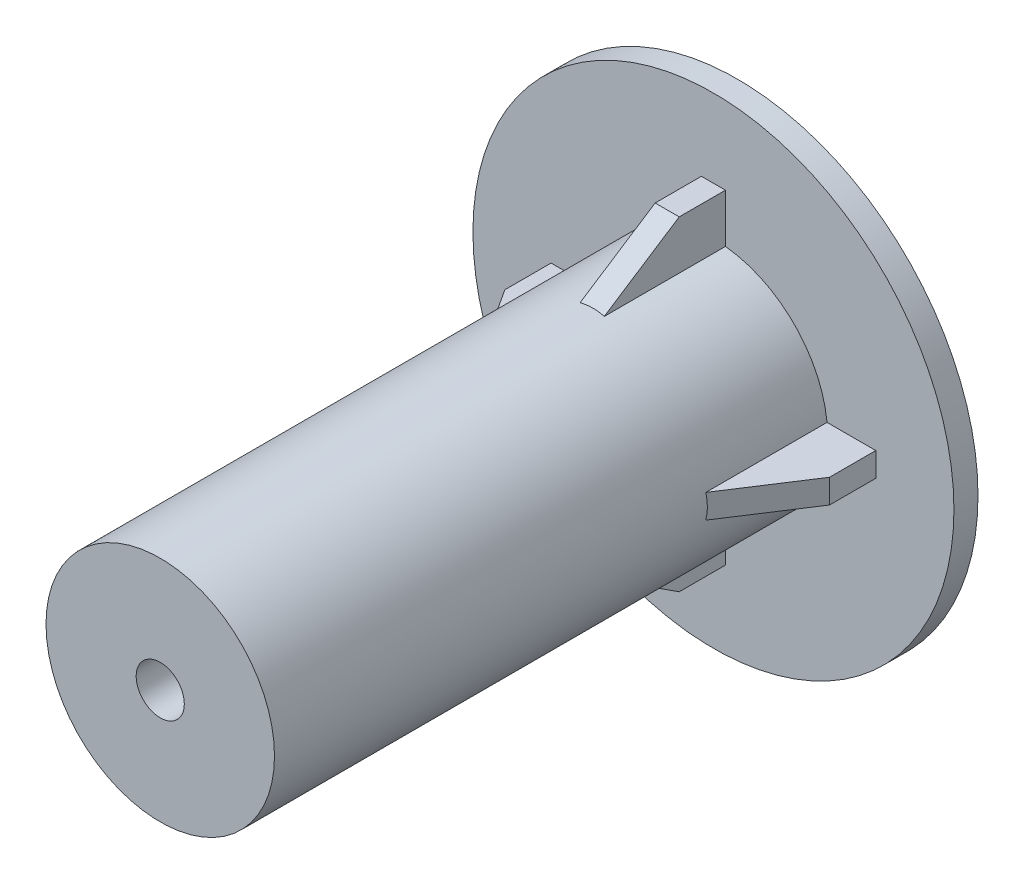
ISO-10303-21;
HEADER;
FILE_DESCRIPTION(('STEP AP214'),'2;1');
FILE_NAME('part.step','',(''),(''),'','','');
FILE_SCHEMA(('AUTOMOTIVE_DESIGN { 1 0 10303 214 1 1 1 1 }'));
ENDSEC;
DATA;
#1=APPLICATION_CONTEXT('core data for automotive mechanical design processes');
#2=APPLICATION_PROTOCOL_DEFINITION('international standard','automotive_design',2000,#1);
#3=PRODUCT_CONTEXT('',#1,'mechanical');
#4=PRODUCT('Part','Part','',(#3));
#5=PRODUCT_RELATED_PRODUCT_CATEGORY('part','',(#4));
#6=PRODUCT_DEFINITION_FORMATION('','',#4);
#7=PRODUCT_DEFINITION_CONTEXT('part definition',#1,'design');
#8=PRODUCT_DEFINITION('design','',#6,#7);
#9=PRODUCT_DEFINITION_SHAPE('','',#8);
#10=(LENGTH_UNIT() NAMED_UNIT(*) SI_UNIT(.MILLI.,.METRE.));
#11=(NAMED_UNIT(*) PLANE_ANGLE_UNIT() SI_UNIT($,.RADIAN.));
#12=(NAMED_UNIT(*) SI_UNIT($,.STERADIAN.) SOLID_ANGLE_UNIT());
#13=UNCERTAINTY_MEASURE_WITH_UNIT(LENGTH_MEASURE(1.E-05),#10,'distance_accuracy_value','');
#14=(GEOMETRIC_REPRESENTATION_CONTEXT(3) GLOBAL_UNCERTAINTY_ASSIGNED_CONTEXT((#13)) GLOBAL_UNIT_ASSIGNED_CONTEXT((#10,
#11,#12)) REPRESENTATION_CONTEXT('',''));
#15=CARTESIAN_POINT('',(0.,0.,0.));
#16=DIRECTION('',(0.,0.,1.));
#17=DIRECTION('',(1.,0.,0.));
#18=AXIS2_PLACEMENT_3D('',#15,#16,#17);
#19=CARTESIAN_POINT('',(0.,0.,230.));
#20=DIRECTION('',(0.,0.,-1.));
#21=DIRECTION('',(-1.,0.,0.));
#22=AXIS2_PLACEMENT_3D('',#19,#20,#21);
#23=CYLINDRICAL_SURFACE('',#22,47.5);
#24=CARTESIAN_POINT('',(0.,0.,123.076923076923));
#25=DIRECTION('',(0.,-0.838443616300637,-0.544988350595414));
#26=DIRECTION('',(0.,0.544988350595414,-0.838443616300637));
#27=AXIS2_PLACEMENT_3D('',#24,#25,#26);
#28=ELLIPSE('',#27,87.1578263060211,47.5);
#29=CARTESIAN_POINT('',(5.00000000000017,47.236109069228,50.4059860473415));
#30=VERTEX_POINT('',#29);
#31=CARTESIAN_POINT('',(-4.99999999999984,47.236109069228,50.4059860473416));
#32=VERTEX_POINT('',#31);
#33=EDGE_CURVE('E214',#30,#32,#28,.F.);
#34=ORIENTED_EDGE('',*,*,#33,.T.);
#35=DIRECTION('',(0.,0.,-1.));
#36=VECTOR('',#35,1.);
#37=CARTESIAN_POINT('',(-4.99999999999984,47.236109069228,230.));
#38=LINE('',#37,#36);
#39=CARTESIAN_POINT('',(-4.99999999999984,47.236109069228,0.));
#40=VERTEX_POINT('',#39);
#41=EDGE_CURVE('E207',#40,#32,#38,.F.);
#42=ORIENTED_EDGE('',*,*,#41,.F.);
#43=CARTESIAN_POINT('',(0.,0.,0.));
#44=DIRECTION('',(0.,0.,-1.));
#45=DIRECTION('',(-1.,0.,0.));
#46=AXIS2_PLACEMENT_3D('',#43,#44,#45);
#47=CIRCLE('',#46,47.5);
#48=CARTESIAN_POINT('',(-47.236109069228,5.,0.));
#49=VERTEX_POINT('',#48);
#50=EDGE_CURVE('E236',#49,#40,#47,.T.);
#51=ORIENTED_EDGE('',*,*,#50,.F.);
#52=DIRECTION('',(0.,0.,-1.));
#53=VECTOR('',#52,1.);
#54=CARTESIAN_POINT('',(-47.236109069228,5.,230.));
#55=LINE('',#54,#53);
#56=CARTESIAN_POINT('',(-47.236109069228,5.,50.4059860473415));
#57=VERTEX_POINT('',#56);
#58=EDGE_CURVE('E225',#49,#57,#55,.F.);
#59=ORIENTED_EDGE('',*,*,#58,.T.);
#60=CARTESIAN_POINT('',(0.,0.,123.076923076923));
#61=DIRECTION('',(0.838443616300637,0.,-0.544988350595414));
#62=DIRECTION('',(-0.544988350595414,0.,-0.838443616300637));
#63=AXIS2_PLACEMENT_3D('',#60,#61,#62);
#64=ELLIPSE('',#63,87.1578263060211,47.5);
#65=CARTESIAN_POINT('',(-47.236109069228,-5.,50.4059860473416));
#66=VERTEX_POINT('',#65);
#67=EDGE_CURVE('E227',#57,#66,#64,.F.);
#68=ORIENTED_EDGE('',*,*,#67,.T.);
#69=DIRECTION('',(0.,0.,-1.));
#70=VECTOR('',#69,1.);
#71=CARTESIAN_POINT('',(-47.236109069228,-5.,230.));
#72=LINE('',#71,#70);
#73=CARTESIAN_POINT('',(-47.236109069228,-5.,0.));
#74=VERTEX_POINT('',#73);
#75=EDGE_CURVE('E220',#74,#66,#72,.F.);
#76=ORIENTED_EDGE('',*,*,#75,.F.);
#77=CARTESIAN_POINT('',(-5.00000000000049,-47.2361090692279,0.));
#78=VERTEX_POINT('',#77);
#79=EDGE_CURVE('E233',#78,#74,#47,.T.);
#80=ORIENTED_EDGE('',*,*,#79,.F.);
#81=DIRECTION('',(0.,0.,-1.));
#82=VECTOR('',#81,1.);
#83=CARTESIAN_POINT('',(-5.00000000000049,-47.2361090692279,230.));
#84=LINE('',#83,#82);
#85=CARTESIAN_POINT('',(-5.0000000000005,-47.236109069228,50.4059860473415));
#86=VERTEX_POINT('',#85);
#87=EDGE_CURVE('E172',#78,#86,#84,.F.);
#88=ORIENTED_EDGE('',*,*,#87,.T.);
#89=CARTESIAN_POINT('',(0.,0.,123.076923076923));
#90=DIRECTION('',(0.,0.838443616300637,-0.544988350595414));
#91=DIRECTION('',(0.,-0.544988350595414,-0.838443616300637));
#92=AXIS2_PLACEMENT_3D('',#89,#90,#91);
#93=ELLIPSE('',#92,87.1578263060211,47.5);
#94=CARTESIAN_POINT('',(4.9999999999995,-47.236109069228,50.4059860473416));
#95=VERTEX_POINT('',#94);
#96=EDGE_CURVE('E184',#86,#95,#93,.F.);
#97=ORIENTED_EDGE('',*,*,#96,.T.);
#98=DIRECTION('',(0.,0.,-1.));
#99=VECTOR('',#98,1.);
#100=CARTESIAN_POINT('',(4.99999999999951,-47.236109069228,230.));
#101=LINE('',#100,#99);
#102=CARTESIAN_POINT('',(4.99999999999951,-47.236109069228,0.));
#103=VERTEX_POINT('',#102);
#104=EDGE_CURVE('E181',#103,#95,#101,.F.);
#105=ORIENTED_EDGE('',*,*,#104,.F.);
#106=CARTESIAN_POINT('',(47.236109069228,-5.,0.));
#107=VERTEX_POINT('',#106);
#108=EDGE_CURVE('E320',#107,#103,#47,.T.);
#109=ORIENTED_EDGE('',*,*,#108,.F.);
#110=DIRECTION('',(0.,0.,-1.));
#111=VECTOR('',#110,1.);
#112=CARTESIAN_POINT('',(47.236109069228,-5.,230.));
#113=LINE('',#112,#111);
#114=CARTESIAN_POINT('',(47.236109069228,-5.,50.4059860473415));
#115=VERTEX_POINT('',#114);
#116=EDGE_CURVE('E194',#107,#115,#113,.F.);
#117=ORIENTED_EDGE('',*,*,#116,.T.);
#118=CARTESIAN_POINT('',(0.,0.,123.076923076923));
#119=DIRECTION('',(-0.838443616300637,0.,-0.544988350595414));
#120=DIRECTION('',(0.544988350595414,0.,-0.838443616300637));
#121=AXIS2_PLACEMENT_3D('',#118,#119,#120);
#122=ELLIPSE('',#121,87.1578263060211,47.5);
#123=CARTESIAN_POINT('',(47.236109069228,5.,50.4059860473416));
#124=VERTEX_POINT('',#123);
#125=EDGE_CURVE('E201',#115,#124,#122,.F.);
#126=ORIENTED_EDGE('',*,*,#125,.T.);
#127=DIRECTION('',(0.,0.,-1.));
#128=VECTOR('',#127,1.);
#129=CARTESIAN_POINT('',(47.236109069228,5.,230.));
#130=LINE('',#129,#128);
#131=CARTESIAN_POINT('',(47.236109069228,5.,0.));
#132=VERTEX_POINT('',#131);
#133=EDGE_CURVE('E198',#132,#124,#130,.F.);
#134=ORIENTED_EDGE('',*,*,#133,.F.);
#135=CARTESIAN_POINT('',(5.00000000000017,47.236109069228,0.));
#136=VERTEX_POINT('',#135);
#137=EDGE_CURVE('E240',#136,#132,#47,.T.);
#138=ORIENTED_EDGE('',*,*,#137,.F.);
#139=DIRECTION('',(0.,0.,-1.));
#140=VECTOR('',#139,1.);
#141=CARTESIAN_POINT('',(5.00000000000017,47.236109069228,230.));
#142=LINE('',#141,#140);
#143=EDGE_CURVE('E212',#136,#30,#142,.F.);
#144=ORIENTED_EDGE('',*,*,#143,.T.);
#145=EDGE_LOOP('',(#34,#42,#51,#59,#68,#76,#80,#88,#97,#105,#109,#117,#126,#134,#138,#144));
#146=FACE_BOUND('',#145,.T.);
#147=CARTESIAN_POINT('',(0.,0.,230.));
#148=DIRECTION('',(0.,0.,1.));
#149=DIRECTION('',(1.,0.,0.));
#150=AXIS2_PLACEMENT_3D('',#147,#148,#149);
#151=CIRCLE('',#150,47.5);
#152=CARTESIAN_POINT('',(47.5,0.,230.));
#153=VERTEX_POINT('',#152);
#154=EDGE_CURVE('E244',#153,#153,#151,.T.);
#155=ORIENTED_EDGE('',*,*,#154,.F.);
#156=EDGE_LOOP('',(#155));
#157=FACE_BOUND('',#156,.T.);
#158=ADVANCED_FACE('F35',(#146,#157),#23,.T.);
#159=CARTESIAN_POINT('',(0.,0.,230.));
#160=DIRECTION('',(0.,0.,1.));
#161=DIRECTION('',(1.,0.,0.));
#162=AXIS2_PLACEMENT_3D('',#159,#160,#161);
#163=PLANE('',#162);
#164=CARTESIAN_POINT('',(0.,0.,230.));
#165=DIRECTION('',(0.,0.,1.));
#166=DIRECTION('',(1.,0.,0.));
#167=AXIS2_PLACEMENT_3D('',#164,#165,#166);
#168=CIRCLE('',#167,10.);
#169=CARTESIAN_POINT('',(10.,0.,230.));
#170=VERTEX_POINT('',#169);
#171=EDGE_CURVE('E239',#170,#170,#168,.T.);
#172=ORIENTED_EDGE('',*,*,#171,.F.);
#173=EDGE_LOOP('',(#172));
#174=FACE_BOUND('',#173,.T.);
#175=ORIENTED_EDGE('',*,*,#154,.T.);
#176=EDGE_LOOP('',(#175));
#177=FACE_BOUND('',#176,.T.);
#178=ADVANCED_FACE('F344',(#174,#177),#163,.T.);
#179=CARTESIAN_POINT('',(0.,0.,210.));
#180=DIRECTION('',(0.,0.,1.));
#181=DIRECTION('',(1.,0.,0.));
#182=AXIS2_PLACEMENT_3D('',#179,#180,#181);
#183=CYLINDRICAL_SURFACE('',#182,10.);
#184=CARTESIAN_POINT('',(0.,0.,210.));
#185=DIRECTION('',(0.,0.,1.));
#186=DIRECTION('',(1.,0.,0.));
#187=AXIS2_PLACEMENT_3D('',#184,#185,#186);
#188=CIRCLE('',#187,10.);
#189=CARTESIAN_POINT('',(10.,0.,210.));
#190=VERTEX_POINT('',#189);
#191=EDGE_CURVE('E241',#190,#190,#188,.T.);
#192=ORIENTED_EDGE('',*,*,#191,.F.);
#193=EDGE_LOOP('',(#192));
#194=FACE_BOUND('',#193,.T.);
#195=ORIENTED_EDGE('',*,*,#171,.T.);
#196=EDGE_LOOP('',(#195));
#197=FACE_BOUND('',#196,.T.);
#198=ADVANCED_FACE('F348',(#194,#197),#183,.F.);
#199=CARTESIAN_POINT('',(0.,0.,210.));
#200=DIRECTION('',(0.,0.,1.));
#201=DIRECTION('',(1.,0.,0.));
#202=AXIS2_PLACEMENT_3D('',#199,#200,#201);
#203=PLANE('',#202);
#204=ORIENTED_EDGE('',*,*,#191,.T.);
#205=EDGE_LOOP('',(#204));
#206=FACE_BOUND('',#205,.T.);
#207=ADVANCED_FACE('F353',(#206),#203,.T.);
#208=CARTESIAN_POINT('',(0.,0.,-10.));
#209=DIRECTION('',(0.,0.,1.));
#210=DIRECTION('',(1.,0.,0.));
#211=AXIS2_PLACEMENT_3D('',#208,#209,#210);
#212=CYLINDRICAL_SURFACE('',#211,100.);
#213=CARTESIAN_POINT('',(0.,0.,-10.));
#214=DIRECTION('',(0.,0.,-1.));
#215=DIRECTION('',(-1.,0.,0.));
#216=AXIS2_PLACEMENT_3D('',#213,#214,#215);
#217=CIRCLE('',#216,100.);
#218=CARTESIAN_POINT('',(-100.,0.,-10.));
#219=VERTEX_POINT('',#218);
#220=EDGE_CURVE('E230',#219,#219,#217,.T.);
#221=ORIENTED_EDGE('',*,*,#220,.F.);
#222=EDGE_LOOP('',(#221));
#223=FACE_BOUND('',#222,.T.);
#224=CARTESIAN_POINT('',(0.,0.,0.));
#225=DIRECTION('',(0.,0.,-1.));
#226=DIRECTION('',(-1.,0.,0.));
#227=AXIS2_PLACEMENT_3D('',#224,#225,#226);
#228=CIRCLE('',#227,100.);
#229=CARTESIAN_POINT('',(-100.,0.,0.));
#230=VERTEX_POINT('',#229);
#231=EDGE_CURVE('E229',#230,#230,#228,.T.);
#232=ORIENTED_EDGE('',*,*,#231,.T.);
#233=EDGE_LOOP('',(#232));
#234=FACE_BOUND('',#233,.T.);
#235=ADVANCED_FACE('F361',(#223,#234),#212,.T.);
#236=CARTESIAN_POINT('',(0.,0.,-10.));
#237=DIRECTION('',(0.,0.,-1.));
#238=DIRECTION('',(-1.,0.,0.));
#239=AXIS2_PLACEMENT_3D('',#236,#237,#238);
#240=PLANE('',#239);
#241=ORIENTED_EDGE('',*,*,#220,.T.);
#242=EDGE_LOOP('',(#241));
#243=FACE_BOUND('',#242,.T.);
#244=ADVANCED_FACE('F365',(#243),#240,.T.);
#245=CARTESIAN_POINT('',(0.,0.,0.));
#246=DIRECTION('',(0.,0.,-1.));
#247=DIRECTION('',(-1.,0.,0.));
#248=AXIS2_PLACEMENT_3D('',#245,#246,#247);
#249=PLANE('',#248);
#250=DIRECTION('',(0.,1.,0.));
#251=VECTOR('',#250,1.);
#252=CARTESIAN_POINT('',(67.5,67.5,0.));
#253=LINE('',#252,#251);
#254=CARTESIAN_POINT('',(67.5,-5.,0.));
#255=VERTEX_POINT('',#254);
#256=CARTESIAN_POINT('',(67.5,5.,0.));
#257=VERTEX_POINT('',#256);
#258=EDGE_CURVE('E553',#255,#257,#253,.T.);
#259=ORIENTED_EDGE('',*,*,#258,.F.);
#260=DIRECTION('',(-1.,0.,0.));
#261=VECTOR('',#260,1.);
#262=CARTESIAN_POINT('',(0.,-5.,0.));
#263=LINE('',#262,#261);
#264=EDGE_CURVE('E190',#255,#107,#263,.T.);
#265=ORIENTED_EDGE('',*,*,#264,.T.);
#266=ORIENTED_EDGE('',*,*,#108,.T.);
#267=DIRECTION('',(0.,1.,0.));
#268=VECTOR('',#267,1.);
#269=CARTESIAN_POINT('',(5.,0.,0.));
#270=LINE('',#269,#268);
#271=CARTESIAN_POINT('',(4.9999999999993,-67.5,0.));
#272=VERTEX_POINT('',#271);
#273=EDGE_CURVE('E168',#272,#103,#270,.T.);
#274=ORIENTED_EDGE('',*,*,#273,.F.);
#275=DIRECTION('',(1.,0.,0.));
#276=VECTOR('',#275,1.);
#277=CARTESIAN_POINT('',(-67.5,-67.5,0.));
#278=LINE('',#277,#276);
#279=CARTESIAN_POINT('',(-5.00000000000071,-67.5,0.));
#280=VERTEX_POINT('',#279);
#281=EDGE_CURVE('E148',#280,#272,#278,.T.);
#282=ORIENTED_EDGE('',*,*,#281,.F.);
#283=DIRECTION('',(0.,1.,0.));
#284=VECTOR('',#283,1.);
#285=CARTESIAN_POINT('',(-5.,0.,0.));
#286=LINE('',#285,#284);
#287=EDGE_CURVE('E165',#280,#78,#286,.T.);
#288=ORIENTED_EDGE('',*,*,#287,.T.);
#289=ORIENTED_EDGE('',*,*,#79,.T.);
#290=DIRECTION('',(1.,0.,0.));
#291=VECTOR('',#290,1.);
#292=CARTESIAN_POINT('',(0.,-5.,0.));
#293=LINE('',#292,#291);
#294=CARTESIAN_POINT('',(-67.5,-5.,0.));
#295=VERTEX_POINT('',#294);
#296=EDGE_CURVE('E249',#295,#74,#293,.T.);
#297=ORIENTED_EDGE('',*,*,#296,.F.);
#298=DIRECTION('',(0.,-1.,0.));
#299=VECTOR('',#298,1.);
#300=CARTESIAN_POINT('',(-67.5,67.5,0.));
#301=LINE('',#300,#299);
#302=CARTESIAN_POINT('',(-67.5,5.,0.));
#303=VERTEX_POINT('',#302);
#304=EDGE_CURVE('E49',#303,#295,#301,.T.);
#305=ORIENTED_EDGE('',*,*,#304,.F.);
#306=DIRECTION('',(1.,0.,0.));
#307=VECTOR('',#306,1.);
#308=CARTESIAN_POINT('',(0.,5.,0.));
#309=LINE('',#308,#307);
#310=EDGE_CURVE('E251',#303,#49,#309,.T.);
#311=ORIENTED_EDGE('',*,*,#310,.T.);
#312=ORIENTED_EDGE('',*,*,#50,.T.);
#313=DIRECTION('',(0.,-1.,0.));
#314=VECTOR('',#313,1.);
#315=CARTESIAN_POINT('',(-5.,0.,0.));
#316=LINE('',#315,#314);
#317=CARTESIAN_POINT('',(-4.99999999999976,67.5,0.));
#318=VERTEX_POINT('',#317);
#319=EDGE_CURVE('E253',#318,#40,#316,.T.);
#320=ORIENTED_EDGE('',*,*,#319,.F.);
#321=DIRECTION('',(-1.,0.,0.));
#322=VECTOR('',#321,1.);
#323=CARTESIAN_POINT('',(-67.5,67.5,0.));
#324=LINE('',#323,#322);
#325=CARTESIAN_POINT('',(5.00000000000024,67.5,0.));
#326=VERTEX_POINT('',#325);
#327=EDGE_CURVE('E56',#326,#318,#324,.T.);
#328=ORIENTED_EDGE('',*,*,#327,.F.);
#329=DIRECTION('',(0.,-1.,0.));
#330=VECTOR('',#329,1.);
#331=CARTESIAN_POINT('',(5.,0.,0.));
#332=LINE('',#331,#330);
#333=EDGE_CURVE('E157',#326,#136,#332,.T.);
#334=ORIENTED_EDGE('',*,*,#333,.T.);
#335=ORIENTED_EDGE('',*,*,#137,.T.);
#336=DIRECTION('',(-1.,0.,0.));
#337=VECTOR('',#336,1.);
#338=CARTESIAN_POINT('',(0.,5.,0.));
#339=LINE('',#338,#337);
#340=EDGE_CURVE('E196',#257,#132,#339,.T.);
#341=ORIENTED_EDGE('',*,*,#340,.F.);
#342=EDGE_LOOP('',(#259,#265,#266,#274,#282,#288,#289,#297,#305,#311,#312,#320,#328,#334,#335,#341));
#343=FACE_BOUND('',#342,.T.);
#344=ORIENTED_EDGE('',*,*,#231,.F.);
#345=EDGE_LOOP('',(#344));
#346=FACE_BOUND('',#345,.T.);
#347=ADVANCED_FACE('F162',(#343,#346),#249,.F.);
#348=CARTESIAN_POINT('',(-47.5,0.,50.));
#349=DIRECTION('',(0.838443616300637,0.,-0.544988350595414));
#350=DIRECTION('',(-0.544988350595414,0.,-0.838443616300637));
#351=AXIS2_PLACEMENT_3D('',#348,#349,#350);
#352=PLANE('',#351);
#353=DIRECTION('',(0.,-1.,0.));
#354=VECTOR('',#353,1.);
#355=CARTESIAN_POINT('',(-67.5,0.,19.2307692307692));
#356=LINE('',#355,#354);
#357=CARTESIAN_POINT('',(-67.5,-5.,19.2307692307692));
#358=VERTEX_POINT('',#357);
#359=CARTESIAN_POINT('',(-67.5,5.,19.2307692307692));
#360=VERTEX_POINT('',#359);
#361=EDGE_CURVE('E277',#358,#360,#356,.F.);
#362=ORIENTED_EDGE('',*,*,#361,.F.);
#363=DIRECTION('',(-0.544988350595414,0.,-0.838443616300637));
#364=VECTOR('',#363,1.);
#365=CARTESIAN_POINT('',(-47.5,-5.,50.));
#366=LINE('',#365,#364);
#367=EDGE_CURVE('E216',#66,#358,#366,.T.);
#368=ORIENTED_EDGE('',*,*,#367,.F.);
#369=ORIENTED_EDGE('',*,*,#67,.F.);
#370=DIRECTION('',(-0.544988350595414,0.,-0.838443616300637));
#371=VECTOR('',#370,1.);
#372=CARTESIAN_POINT('',(-47.5,5.,50.));
#373=LINE('',#372,#371);
#374=EDGE_CURVE('E217',#57,#360,#373,.T.);
#375=ORIENTED_EDGE('',*,*,#374,.T.);
#376=EDGE_LOOP('',(#362,#368,#369,#375));
#377=FACE_BOUND('',#376,.T.);
#378=ADVANCED_FACE('F329',(#377),#352,.F.);
#379=CARTESIAN_POINT('',(0.,5.,110.));
#380=DIRECTION('',(0.,1.,0.));
#381=DIRECTION('',(0.,0.,1.));
#382=AXIS2_PLACEMENT_3D('',#379,#380,#381);
#383=PLANE('',#382);
#384=DIRECTION('',(0.,0.,-1.));
#385=VECTOR('',#384,1.);
#386=CARTESIAN_POINT('',(-67.5,5.,110.));
#387=LINE('',#386,#385);
#388=EDGE_CURVE('E285',#360,#303,#387,.T.);
#389=ORIENTED_EDGE('',*,*,#388,.F.);
#390=ORIENTED_EDGE('',*,*,#374,.F.);
#391=ORIENTED_EDGE('',*,*,#58,.F.);
#392=ORIENTED_EDGE('',*,*,#310,.F.);
#393=EDGE_LOOP('',(#389,#390,#391,#392));
#394=FACE_BOUND('',#393,.T.);
#395=ADVANCED_FACE('F333',(#394),#383,.T.);
#396=CARTESIAN_POINT('',(0.,-5.,110.));
#397=DIRECTION('',(0.,1.,0.));
#398=DIRECTION('',(0.,0.,1.));
#399=AXIS2_PLACEMENT_3D('',#396,#397,#398);
#400=PLANE('',#399);
#401=ORIENTED_EDGE('',*,*,#367,.T.);
#402=DIRECTION('',(0.,0.,-1.));
#403=VECTOR('',#402,1.);
#404=CARTESIAN_POINT('',(-67.5,-5.,110.));
#405=LINE('',#404,#403);
#406=EDGE_CURVE('E12',#358,#295,#405,.T.);
#407=ORIENTED_EDGE('',*,*,#406,.T.);
#408=ORIENTED_EDGE('',*,*,#296,.T.);
#409=ORIENTED_EDGE('',*,*,#75,.T.);
#410=EDGE_LOOP('',(#401,#407,#408,#409));
#411=FACE_BOUND('',#410,.T.);
#412=ADVANCED_FACE('F326',(#411),#400,.F.);
#413=CARTESIAN_POINT('',(1.65845363595049E-13,47.5,50.));
#414=DIRECTION('',(0.,-0.838443616300637,-0.544988350595414));
#415=DIRECTION('',(0.,0.544988350595414,-0.838443616300637));
#416=AXIS2_PLACEMENT_3D('',#413,#414,#415);
#417=PLANE('',#416);
#418=DIRECTION('',(-1.,0.,0.));
#419=VECTOR('',#418,1.);
#420=CARTESIAN_POINT('',(0.,67.5,19.2307692307692));
#421=LINE('',#420,#419);
#422=CARTESIAN_POINT('',(-4.99999999999976,67.5,19.2307692307693));
#423=VERTEX_POINT('',#422);
#424=CARTESIAN_POINT('',(5.00000000000037,67.5,19.2307692307692));
#425=VERTEX_POINT('',#424);
#426=EDGE_CURVE('E272',#423,#425,#421,.F.);
#427=ORIENTED_EDGE('',*,*,#426,.F.);
#428=DIRECTION('',(0.,0.544988350595414,-0.838443616300637));
#429=VECTOR('',#428,1.);
#430=CARTESIAN_POINT('',(-4.99999999999983,47.5,50.));
#431=LINE('',#430,#429);
#432=EDGE_CURVE('E203',#32,#423,#431,.T.);
#433=ORIENTED_EDGE('',*,*,#432,.F.);
#434=ORIENTED_EDGE('',*,*,#33,.F.);
#435=DIRECTION('',(0.,0.544988350595414,-0.838443616300637));
#436=VECTOR('',#435,1.);
#437=CARTESIAN_POINT('',(5.00000000000017,47.5,50.));
#438=LINE('',#437,#436);
#439=EDGE_CURVE('E204',#30,#425,#438,.T.);
#440=ORIENTED_EDGE('',*,*,#439,.T.);
#441=EDGE_LOOP('',(#427,#433,#434,#440));
#442=FACE_BOUND('',#441,.T.);
#443=ADVANCED_FACE('F270',(#442),#417,.F.);
#444=CARTESIAN_POINT('',(5.,0.,110.));
#445=DIRECTION('',(1.,0.,0.));
#446=DIRECTION('',(0.,1.,0.));
#447=AXIS2_PLACEMENT_3D('',#444,#445,#446);
#448=PLANE('',#447);
#449=DIRECTION('',(0.,0.,-1.));
#450=VECTOR('',#449,1.);
#451=CARTESIAN_POINT('',(5.00000000000024,67.5,110.));
#452=LINE('',#451,#450);
#453=EDGE_CURVE('E274',#425,#326,#452,.T.);
#454=ORIENTED_EDGE('',*,*,#453,.F.);
#455=ORIENTED_EDGE('',*,*,#439,.F.);
#456=ORIENTED_EDGE('',*,*,#143,.F.);
#457=ORIENTED_EDGE('',*,*,#333,.F.);
#458=EDGE_LOOP('',(#454,#455,#456,#457));
#459=FACE_BOUND('',#458,.T.);
#460=ADVANCED_FACE('F406',(#459),#448,.T.);
#461=CARTESIAN_POINT('',(-5.,0.,110.));
#462=DIRECTION('',(1.,0.,0.));
#463=DIRECTION('',(0.,1.,0.));
#464=AXIS2_PLACEMENT_3D('',#461,#462,#463);
#465=PLANE('',#464);
#466=ORIENTED_EDGE('',*,*,#432,.T.);
#467=DIRECTION('',(0.,0.,-1.));
#468=VECTOR('',#467,1.);
#469=CARTESIAN_POINT('',(-4.99999999999976,67.5,110.));
#470=LINE('',#469,#468);
#471=EDGE_CURVE('E42',#423,#318,#470,.T.);
#472=ORIENTED_EDGE('',*,*,#471,.T.);
#473=ORIENTED_EDGE('',*,*,#319,.T.);
#474=ORIENTED_EDGE('',*,*,#41,.T.);
#475=EDGE_LOOP('',(#466,#472,#473,#474));
#476=FACE_BOUND('',#475,.T.);
#477=ADVANCED_FACE('F258',(#476),#465,.F.);
#478=CARTESIAN_POINT('',(47.5,0.,50.));
#479=DIRECTION('',(-0.838443616300637,0.,-0.544988350595414));
#480=DIRECTION('',(0.544988350595414,0.,-0.838443616300637));
#481=AXIS2_PLACEMENT_3D('',#478,#479,#480);
#482=PLANE('',#481);
#483=DIRECTION('',(0.,1.,0.));
#484=VECTOR('',#483,1.);
#485=CARTESIAN_POINT('',(67.5,0.,19.2307692307692));
#486=LINE('',#485,#484);
#487=CARTESIAN_POINT('',(67.5,5.,19.2307692307692));
#488=VERTEX_POINT('',#487);
#489=CARTESIAN_POINT('',(67.5,-5.,19.2307692307692));
#490=VERTEX_POINT('',#489);
#491=EDGE_CURVE('E280',#488,#490,#486,.F.);
#492=ORIENTED_EDGE('',*,*,#491,.F.);
#493=DIRECTION('',(0.544988350595414,0.,-0.838443616300637));
#494=VECTOR('',#493,1.);
#495=CARTESIAN_POINT('',(47.5,5.,50.));
#496=LINE('',#495,#494);
#497=EDGE_CURVE('E186',#124,#488,#496,.T.);
#498=ORIENTED_EDGE('',*,*,#497,.F.);
#499=ORIENTED_EDGE('',*,*,#125,.F.);
#500=DIRECTION('',(0.544988350595414,0.,-0.838443616300637));
#501=VECTOR('',#500,1.);
#502=CARTESIAN_POINT('',(47.5,-5.,50.));
#503=LINE('',#502,#501);
#504=EDGE_CURVE('E187',#115,#490,#503,.T.);
#505=ORIENTED_EDGE('',*,*,#504,.T.);
#506=EDGE_LOOP('',(#492,#498,#499,#505));
#507=FACE_BOUND('',#506,.T.);
#508=ADVANCED_FACE('F311',(#507),#482,.F.);
#509=CARTESIAN_POINT('',(0.,5.,110.));
#510=DIRECTION('',(0.,-1.,0.));
#511=DIRECTION('',(0.,0.,-1.));
#512=AXIS2_PLACEMENT_3D('',#509,#510,#511);
#513=PLANE('',#512);
#514=ORIENTED_EDGE('',*,*,#497,.T.);
#515=DIRECTION('',(0.,0.,-1.));
#516=VECTOR('',#515,1.);
#517=CARTESIAN_POINT('',(67.5,5.,110.));
#518=LINE('',#517,#516);
#519=EDGE_CURVE('E275',#488,#257,#518,.T.);
#520=ORIENTED_EDGE('',*,*,#519,.T.);
#521=ORIENTED_EDGE('',*,*,#340,.T.);
#522=ORIENTED_EDGE('',*,*,#133,.T.);
#523=EDGE_LOOP('',(#514,#520,#521,#522));
#524=FACE_BOUND('',#523,.T.);
#525=ADVANCED_FACE('F316',(#524),#513,.F.);
#526=CARTESIAN_POINT('',(0.,-5.,110.));
#527=DIRECTION('',(0.,-1.,0.));
#528=DIRECTION('',(0.,0.,-1.));
#529=AXIS2_PLACEMENT_3D('',#526,#527,#528);
#530=PLANE('',#529);
#531=DIRECTION('',(0.,0.,-1.));
#532=VECTOR('',#531,1.);
#533=CARTESIAN_POINT('',(67.5,-5.,110.));
#534=LINE('',#533,#532);
#535=EDGE_CURVE('E156',#490,#255,#534,.T.);
#536=ORIENTED_EDGE('',*,*,#535,.F.);
#537=ORIENTED_EDGE('',*,*,#504,.F.);
#538=ORIENTED_EDGE('',*,*,#116,.F.);
#539=ORIENTED_EDGE('',*,*,#264,.F.);
#540=EDGE_LOOP('',(#536,#537,#538,#539));
#541=FACE_BOUND('',#540,.T.);
#542=ADVANCED_FACE('F308',(#541),#530,.T.);
#543=CARTESIAN_POINT('',(-4.97536090785147E-13,-47.5,50.));
#544=DIRECTION('',(0.,0.838443616300637,-0.544988350595414));
#545=DIRECTION('',(0.,-0.544988350595414,-0.838443616300637));
#546=AXIS2_PLACEMENT_3D('',#543,#544,#545);
#547=PLANE('',#546);
#548=DIRECTION('',(1.,0.,0.));
#549=VECTOR('',#548,1.);
#550=CARTESIAN_POINT('',(0.,-67.5,19.2307692307692));
#551=LINE('',#550,#549);
#552=CARTESIAN_POINT('',(4.9999999999995,-67.5,19.2307692307693));
#553=VERTEX_POINT('',#552);
#554=CARTESIAN_POINT('',(-5.00000000000071,-67.5,19.2307692307691));
#555=VERTEX_POINT('',#554);
#556=EDGE_CURVE('E151',#553,#555,#551,.F.);
#557=ORIENTED_EDGE('',*,*,#556,.F.);
#558=DIRECTION('',(0.,-0.544988350595414,-0.838443616300637));
#559=VECTOR('',#558,1.);
#560=CARTESIAN_POINT('',(4.9999999999995,-47.5000000000001,50.));
#561=LINE('',#560,#559);
#562=EDGE_CURVE('E176',#95,#553,#561,.T.);
#563=ORIENTED_EDGE('',*,*,#562,.F.);
#564=ORIENTED_EDGE('',*,*,#96,.F.);
#565=DIRECTION('',(0.,-0.544988350595414,-0.838443616300637));
#566=VECTOR('',#565,1.);
#567=CARTESIAN_POINT('',(-5.0000000000005,-47.5,50.));
#568=LINE('',#567,#566);
#569=EDGE_CURVE('E173',#86,#555,#568,.T.);
#570=ORIENTED_EDGE('',*,*,#569,.T.);
#571=EDGE_LOOP('',(#557,#563,#564,#570));
#572=FACE_BOUND('',#571,.T.);
#573=ADVANCED_FACE('F295',(#572),#547,.F.);
#574=CARTESIAN_POINT('',(5.,0.,110.));
#575=DIRECTION('',(-1.,0.,0.));
#576=DIRECTION('',(0.,-1.,0.));
#577=AXIS2_PLACEMENT_3D('',#574,#575,#576);
#578=PLANE('',#577);
#579=ORIENTED_EDGE('',*,*,#562,.T.);
#580=DIRECTION('',(0.,0.,-1.));
#581=VECTOR('',#580,1.);
#582=CARTESIAN_POINT('',(4.99999999999929,-67.5,110.));
#583=LINE('',#582,#581);
#584=EDGE_CURVE('E291',#553,#272,#583,.T.);
#585=ORIENTED_EDGE('',*,*,#584,.T.);
#586=ORIENTED_EDGE('',*,*,#273,.T.);
#587=ORIENTED_EDGE('',*,*,#104,.T.);
#588=EDGE_LOOP('',(#579,#585,#586,#587));
#589=FACE_BOUND('',#588,.T.);
#590=ADVANCED_FACE('F290',(#589),#578,.F.);
#591=CARTESIAN_POINT('',(-5.,0.,110.));
#592=DIRECTION('',(-1.,0.,0.));
#593=DIRECTION('',(0.,-1.,0.));
#594=AXIS2_PLACEMENT_3D('',#591,#592,#593);
#595=PLANE('',#594);
#596=DIRECTION('',(0.,0.,-1.));
#597=VECTOR('',#596,1.);
#598=CARTESIAN_POINT('',(-5.00000000000071,-67.5,110.));
#599=LINE('',#598,#597);
#600=EDGE_CURVE('E145',#555,#280,#599,.T.);
#601=ORIENTED_EDGE('',*,*,#600,.F.);
#602=ORIENTED_EDGE('',*,*,#569,.F.);
#603=ORIENTED_EDGE('',*,*,#87,.F.);
#604=ORIENTED_EDGE('',*,*,#287,.F.);
#605=EDGE_LOOP('',(#601,#602,#603,#604));
#606=FACE_BOUND('',#605,.T.);
#607=ADVANCED_FACE('F171',(#606),#595,.T.);
#608=CARTESIAN_POINT('',(-67.5,-67.5,73.));
#609=DIRECTION('',(0.,1.,0.));
#610=DIRECTION('',(0.,0.,1.));
#611=AXIS2_PLACEMENT_3D('',#608,#609,#610);
#612=PLANE('',#611);
#613=ORIENTED_EDGE('',*,*,#556,.T.);
#614=ORIENTED_EDGE('',*,*,#600,.T.);
#615=ORIENTED_EDGE('',*,*,#281,.T.);
#616=ORIENTED_EDGE('',*,*,#584,.F.);
#617=EDGE_LOOP('',(#613,#614,#615,#616));
#618=FACE_BOUND('',#617,.T.);
#619=ADVANCED_FACE('F147',(#618),#612,.F.);
#620=CARTESIAN_POINT('',(67.5,67.5,73.));
#621=DIRECTION('',(-1.,0.,0.));
#622=DIRECTION('',(0.,-1.,0.));
#623=AXIS2_PLACEMENT_3D('',#620,#621,#622);
#624=PLANE('',#623);
#625=ORIENTED_EDGE('',*,*,#491,.T.);
#626=ORIENTED_EDGE('',*,*,#535,.T.);
#627=ORIENTED_EDGE('',*,*,#258,.T.);
#628=ORIENTED_EDGE('',*,*,#519,.F.);
#629=EDGE_LOOP('',(#625,#626,#627,#628));
#630=FACE_BOUND('',#629,.T.);
#631=ADVANCED_FACE('F302',(#630),#624,.F.);
#632=CARTESIAN_POINT('',(-67.5,67.5,73.));
#633=DIRECTION('',(0.,-1.,0.));
#634=DIRECTION('',(0.,0.,-1.));
#635=AXIS2_PLACEMENT_3D('',#632,#633,#634);
#636=PLANE('',#635);
#637=ORIENTED_EDGE('',*,*,#453,.T.);
#638=ORIENTED_EDGE('',*,*,#327,.T.);
#639=ORIENTED_EDGE('',*,*,#471,.F.);
#640=ORIENTED_EDGE('',*,*,#426,.T.);
#641=EDGE_LOOP('',(#637,#638,#639,#640));
#642=FACE_BOUND('',#641,.T.);
#643=ADVANCED_FACE('F487',(#642),#636,.F.);
#644=CARTESIAN_POINT('',(-67.5,67.5,73.));
#645=DIRECTION('',(1.,0.,0.));
#646=DIRECTION('',(0.,0.,-1.));
#647=AXIS2_PLACEMENT_3D('',#644,#645,#646);
#648=PLANE('',#647);
#649=ORIENTED_EDGE('',*,*,#388,.T.);
#650=ORIENTED_EDGE('',*,*,#304,.T.);
#651=ORIENTED_EDGE('',*,*,#406,.F.);
#652=ORIENTED_EDGE('',*,*,#361,.T.);
#653=EDGE_LOOP('',(#649,#650,#651,#652));
#654=FACE_BOUND('',#653,.T.);
#655=ADVANCED_FACE('F331',(#654),#648,.F.);
#656=CLOSED_SHELL('',(#158,#178,#198,#207,#235,#244,#347,#378,#395,#412,#443,#460,#477,#508,
#525,#542,#573,#590,#607,#619,#631,#643,#655));
#657=MANIFOLD_SOLID_BREP('B2',#656);
#658=ADVANCED_BREP_SHAPE_REPRESENTATION('',(#18,#657),#14);
#659=SHAPE_DEFINITION_REPRESENTATION(#9,#658);
ENDSEC;
END-ISO-10303-21;
